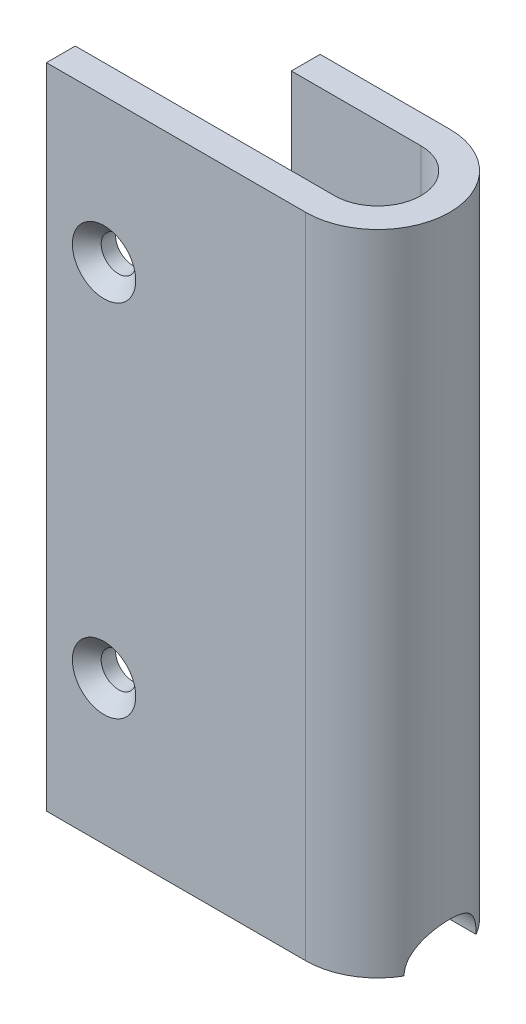
ISO-10303-21;
HEADER;
FILE_DESCRIPTION(('STEP AP214'),'2;1');
FILE_NAME('part.step','',(''),(''),'','','');
FILE_SCHEMA(('AUTOMOTIVE_DESIGN { 1 0 10303 214 1 1 1 1 }'));
ENDSEC;
DATA;
#1=APPLICATION_CONTEXT('core data for automotive mechanical design processes');
#2=APPLICATION_PROTOCOL_DEFINITION('international standard','automotive_design',2000,#1);
#3=PRODUCT_CONTEXT('',#1,'mechanical');
#4=PRODUCT('Part','Part','',(#3));
#5=PRODUCT_RELATED_PRODUCT_CATEGORY('part','',(#4));
#6=PRODUCT_DEFINITION_FORMATION('','',#4);
#7=PRODUCT_DEFINITION_CONTEXT('part definition',#1,'design');
#8=PRODUCT_DEFINITION('design','',#6,#7);
#9=PRODUCT_DEFINITION_SHAPE('','',#8);
#10=(LENGTH_UNIT() NAMED_UNIT(*) SI_UNIT(.MILLI.,.METRE.));
#11=(NAMED_UNIT(*) PLANE_ANGLE_UNIT() SI_UNIT($,.RADIAN.));
#12=(NAMED_UNIT(*) SI_UNIT($,.STERADIAN.) SOLID_ANGLE_UNIT());
#13=UNCERTAINTY_MEASURE_WITH_UNIT(LENGTH_MEASURE(1.E-05),#10,'distance_accuracy_value','');
#14=(GEOMETRIC_REPRESENTATION_CONTEXT(3) GLOBAL_UNCERTAINTY_ASSIGNED_CONTEXT((#13)) GLOBAL_UNIT_ASSIGNED_CONTEXT((#10,
#11,#12)) REPRESENTATION_CONTEXT('',''));
#15=CARTESIAN_POINT('',(0.,0.,0.));
#16=DIRECTION('',(0.,0.,1.));
#17=DIRECTION('',(1.,0.,0.));
#18=AXIS2_PLACEMENT_3D('',#15,#16,#17);
#19=CARTESIAN_POINT('',(0.,45.,0.));
#20=DIRECTION('',(0.,-1.,0.));
#21=DIRECTION('',(0.,0.,-1.));
#22=AXIS2_PLACEMENT_3D('',#19,#20,#21);
#23=CYLINDRICAL_SURFACE('',#22,5.);
#24=CARTESIAN_POINT('',(4.33012701892219,0.,-2.5));
#25=CARTESIAN_POINT('',(4.33010776213733,0.0654724350316677,-2.50001179836251));
#26=CARTESIAN_POINT('',(4.33161146224051,0.130934169776571,-2.49742842336447));
#27=CARTESIAN_POINT('',(4.33751978184666,0.261285899844576,-2.48716418163323));
#28=CARTESIAN_POINT('',(4.34192261900449,0.326176221640754,-2.47948644681233));
#29=CARTESIAN_POINT('',(4.35345141400719,0.454547532744297,-2.45918447990414));
#30=CARTESIAN_POINT('',(4.36056161975426,0.518034467963284,-2.44658885069503));
#31=CARTESIAN_POINT('',(4.37724282284499,0.643527614087744,-2.41661724515945));
#32=CARTESIAN_POINT('',(4.38681410283551,0.705533654022406,-2.3992407197456));
#33=CARTESIAN_POINT('',(4.41871214349951,0.888464031589053,-2.34029688750615));
#34=CARTESIAN_POINT('',(4.44426107983369,1.00668892728128,-2.29185258147667));
#35=CARTESIAN_POINT('',(4.50102114369154,1.23341693587535,-2.17826216975077));
#36=CARTESIAN_POINT('',(4.53224102252611,1.34190463038616,-2.11309018504652));
#37=CARTESIAN_POINT('',(4.59992530155802,1.55577114238783,-1.96165876169868));
#38=CARTESIAN_POINT('',(4.63660980230517,1.66016997889454,-1.87411057186877));
#39=CARTESIAN_POINT('',(4.70930785657946,1.85354271470454,-1.68311069098592));
#40=CARTESIAN_POINT('',(4.74532122571924,1.94251242917414,-1.57965469957761));
#41=CARTESIAN_POINT('',(4.81553674339751,2.10841707238449,-1.35122448738113));
#42=CARTESIAN_POINT('',(4.84945238909967,2.18413370998771,-1.22526897701463));
#43=CARTESIAN_POINT('',(4.90876871743035,2.31285185160815,-0.960393600863944));
#44=CARTESIAN_POINT('',(4.93417470668173,2.3658675177187,-0.821481883935598));
#45=CARTESIAN_POINT('',(4.9720113803684,2.44376131740857,-0.545113455243545));
#46=CARTESIAN_POINT('',(4.98523678997644,2.47037337425095,-0.408256720567087));
#47=CARTESIAN_POINT('',(5.00018956643823,2.50041524569561,-0.131428863746883));
#48=CARTESIAN_POINT('',(5.00192370311413,2.50385870956598,0.00854037595561001));
#49=CARTESIAN_POINT('',(4.99407451216908,2.48813324304431,0.274582525450838));
#50=CARTESIAN_POINT('',(4.98546223180199,2.47090463519448,0.40080541240597));
#51=CARTESIAN_POINT('',(4.95935579725978,2.41779719968455,0.648286752405086));
#52=CARTESIAN_POINT('',(4.94186114786187,2.38191733214957,0.769544928241872));
#53=CARTESIAN_POINT('',(4.89928974288563,2.29229393966775,1.00577259267237));
#54=CARTESIAN_POINT('',(4.87411141896958,2.23831009471259,1.12063184244932));
#55=CARTESIAN_POINT('',(4.81844159486509,2.11434242062065,1.3399404674424));
#56=CARTESIAN_POINT('',(4.78794811508603,2.04435262714526,1.44438594125974));
#57=CARTESIAN_POINT('',(4.72111214797706,1.8827673990732,1.65042713157186));
#58=CARTESIAN_POINT('',(4.68448924833205,1.78975568976913,1.75082198597595));
#59=CARTESIAN_POINT('',(4.61136315843599,1.58853854847496,1.9352501871044));
#60=CARTESIAN_POINT('',(4.5748601047173,1.48031958801658,2.01926880480682));
#61=CARTESIAN_POINT('',(4.503579139904,1.24330068232173,2.1738171411083));
#62=CARTESIAN_POINT('',(4.46906219482226,1.11362572851798,2.24313548885981));
#63=CARTESIAN_POINT('',(4.40934996096533,0.842442531530035,2.35836398289386));
#64=CARTESIAN_POINT('',(4.38413238163266,0.700963594907247,2.40433020546799));
#65=CARTESIAN_POINT('',(4.35412015572563,0.465222711798028,2.45809029210406));
#66=CARTESIAN_POINT('',(4.34521143406772,0.373217559621034,2.47373896858613));
#67=CARTESIAN_POINT('',(4.33317629399904,0.187508830095871,2.49472015739655));
#68=CARTESIAN_POINT('',(4.33006008341912,0.0938025477150808,2.50003445877024));
#69=CARTESIAN_POINT('',(4.33012701892219,0.,2.5));
#70=B_SPLINE_CURVE_WITH_KNOTS('',3,(#24,#25,#26,#27,#28,#29,#30,#31,#32,#33,#34,#35,#36,#37,#38,
#39,#40,#41,#42,#43,#44,#45,#46,#47,#48,#49,#50,#51,#52,#53,#54,#55,#56,#57,#58,#59,#60,#61,#62,
#63,#64,#65,#66,#67,#68,#69),.UNSPECIFIED.,.F.,.F.,(4,2,2,2,2,2,2,2,2,2,2,2,2,2,2,2,2,2,2,2,2,2,
4),(0.,0.196331555537111,0.392542521988314,0.587628912502733,0.782737718108245,1.17178476798555,
1.56143737011987,1.98295902719593,2.40459483519142,2.85470113901088,3.30452623161875,
3.72233927392692,4.13990614928148,4.52116163006039,4.90243836948527,5.28899106640394,
5.67568804085465,6.09890794628564,6.52250676283661,6.97328472614771,7.42297504209209,
7.703516039156,7.98455095154996),.UNSPECIFIED.);
#71=CARTESIAN_POINT('',(4.33012701892219,0.,-2.5));
#72=VERTEX_POINT('',#71);
#73=CARTESIAN_POINT('',(4.33012701892219,0.,2.5));
#74=VERTEX_POINT('',#73);
#75=EDGE_CURVE('E53',#72,#74,#70,.T.);
#76=ORIENTED_EDGE('',*,*,#75,.F.);
#77=CARTESIAN_POINT('',(0.,0.,0.));
#78=DIRECTION('',(0.,1.,0.));
#79=DIRECTION('',(0.,0.,1.));
#80=AXIS2_PLACEMENT_3D('',#77,#78,#79);
#81=CIRCLE('',#80,5.);
#82=CARTESIAN_POINT('',(0.,0.,-5.));
#83=VERTEX_POINT('',#82);
#84=EDGE_CURVE('E255',#72,#83,#81,.T.);
#85=ORIENTED_EDGE('',*,*,#84,.T.);
#86=DIRECTION('',(0.,-1.,0.));
#87=VECTOR('',#86,1.);
#88=CARTESIAN_POINT('',(0.,45.,-5.));
#89=LINE('',#88,#87);
#90=CARTESIAN_POINT('',(0.,45.,-5.));
#91=VERTEX_POINT('',#90);
#92=EDGE_CURVE('E183',#91,#83,#89,.T.);
#93=ORIENTED_EDGE('',*,*,#92,.F.);
#94=CARTESIAN_POINT('',(0.,45.,0.));
#95=DIRECTION('',(0.,1.,0.));
#96=DIRECTION('',(0.,0.,1.));
#97=AXIS2_PLACEMENT_3D('',#94,#95,#96);
#98=CIRCLE('',#97,5.);
#99=CARTESIAN_POINT('',(0.,45.,5.));
#100=VERTEX_POINT('',#99);
#101=EDGE_CURVE('E160',#100,#91,#98,.T.);
#102=ORIENTED_EDGE('',*,*,#101,.F.);
#103=DIRECTION('',(0.,-1.,0.));
#104=VECTOR('',#103,1.);
#105=CARTESIAN_POINT('',(0.,45.,5.));
#106=LINE('',#105,#104);
#107=CARTESIAN_POINT('',(0.,0.,5.));
#108=VERTEX_POINT('',#107);
#109=EDGE_CURVE('E161',#100,#108,#106,.T.);
#110=ORIENTED_EDGE('',*,*,#109,.T.);
#111=EDGE_CURVE('E257',#108,#74,#81,.T.);
#112=ORIENTED_EDGE('',*,*,#111,.T.);
#113=EDGE_LOOP('',(#76,#85,#93,#102,#110,#112));
#114=FACE_BOUND('',#113,.T.);
#115=ADVANCED_FACE('F37',(#114),#23,.T.);
#116=CARTESIAN_POINT('',(0.,45.,0.));
#117=DIRECTION('',(0.,-1.,0.));
#118=DIRECTION('',(0.,0.,-1.));
#119=AXIS2_PLACEMENT_3D('',#116,#117,#118);
#120=CYLINDRICAL_SURFACE('',#119,3.);
#121=CARTESIAN_POINT('',(1.6583123951777,0.,2.5));
#122=CARTESIAN_POINT('',(1.65828023930748,0.0446676190961317,2.50001053689097));
#123=CARTESIAN_POINT('',(1.6601162772629,0.0893146756582369,2.4988033626358));
#124=CARTESIAN_POINT('',(1.66727317263237,0.178118808575002,2.49403945424106));
#125=CARTESIAN_POINT('',(1.6725873117957,0.222276662985004,2.49048724961452));
#126=CARTESIAN_POINT('',(1.68634898291668,0.309186552805204,2.48118723003889));
#127=CARTESIAN_POINT('',(1.69474943169534,0.351949707497493,2.47547237004125));
#128=CARTESIAN_POINT('',(1.71430901873713,0.436516845554968,2.46196831278083));
#129=CARTESIAN_POINT('',(1.72546968412583,0.478320283905717,2.4541779670438));
#130=CARTESIAN_POINT('',(1.77222694334977,0.634726425048257,2.42094569151118));
#131=CARTESIAN_POINT('',(1.81578246635465,0.745590990119863,2.38888265367655));
#132=CARTESIAN_POINT('',(1.91309058631366,0.958667215286081,2.31170305357438));
#133=CARTESIAN_POINT('',(1.96692669689501,1.06079733200861,2.26647787223487));
#134=CARTESIAN_POINT('',(2.06333806009318,1.22908717969098,2.17845139252835));
#135=CARTESIAN_POINT('',(2.1048774408808,1.29734727342663,2.13847839662807));
#136=CARTESIAN_POINT('',(2.18877312173698,1.42945216003766,2.05253160808423));
#137=CARTESIAN_POINT('',(2.23112976012055,1.49329507193551,2.00655528279989));
#138=CARTESIAN_POINT('',(2.35737927069942,1.6779004660602,1.85992335660286));
#139=CARTESIAN_POINT('',(2.44073385868862,1.79220223726549,1.75032166679399));
#140=CARTESIAN_POINT('',(2.58107663651362,1.97858484857952,1.53332316028441));
#141=CARTESIAN_POINT('',(2.63991085386503,2.05448117836859,1.43037180448629));
#142=CARTESIAN_POINT('',(2.74774689794263,2.1913233385864,1.2102993528412));
#143=CARTESIAN_POINT('',(2.79676246687923,2.25229009148166,1.09319843428568));
#144=CARTESIAN_POINT('',(2.87372981565163,2.34711358323241,0.867928883305844));
#145=CARTESIAN_POINT('',(2.90385830152504,2.38383517864743,0.761717046456572));
#146=CARTESIAN_POINT('',(2.95260444248339,2.44298114981979,0.542830448073814));
#147=CARTESIAN_POINT('',(2.97122910862281,2.46541423403497,0.430159668824158));
#148=CARTESIAN_POINT('',(2.99549159829453,2.49460149180071,0.200906226670661));
#149=CARTESIAN_POINT('',(3.00107488681869,2.50128982658614,0.084309197767444));
#150=CARTESIAN_POINT('',(2.99858143920542,2.49829775944192,-0.148527340090261));
#151=CARTESIAN_POINT('',(2.99050499932993,2.48861771252143,-0.264766856743951));
#152=CARTESIAN_POINT('',(2.9624133944372,2.45478579221321,-0.485445759029536));
#153=CARTESIAN_POINT('',(2.94323604357122,2.4316490006219,-0.590153469719608));
#154=CARTESIAN_POINT('',(2.89501327215416,2.37305235039453,-0.793625750717645));
#155=CARTESIAN_POINT('',(2.86596638567854,2.33759066112049,-0.89238943559136));
#156=CARTESIAN_POINT('',(2.79690287446882,2.25240860554023,-1.09053416369654));
#157=CARTESIAN_POINT('',(2.7561602110168,2.20172771983301,-1.18924473934223));
#158=CARTESIAN_POINT('',(2.66744714285833,2.08960269254212,-1.37678007181262));
#159=CARTESIAN_POINT('',(2.61947031903861,2.02814898391746,-1.46559592577918));
#160=CARTESIAN_POINT('',(2.49448801107938,1.86454080960493,-1.67280362441447));
#161=CARTESIAN_POINT('',(2.41452810108691,1.75692904106795,-1.78517382835749));
#162=CARTESIAN_POINT('',(2.29203972156857,1.58276013263233,-1.93670155603641));
#163=CARTESIAN_POINT('',(2.25072647403066,1.52248619627438,-1.98442714978064));
#164=CARTESIAN_POINT('',(2.16828385513605,1.3977282287984,-2.07418686478912));
#165=CARTESIAN_POINT('',(2.12715442261522,1.33324573004269,-2.11622304065683));
#166=CARTESIAN_POINT('',(2.02736668216146,1.16889290959049,-2.2128219038431));
#167=CARTESIAN_POINT('',(1.96949413582952,1.06656162182181,-2.26406445132993));
#168=CARTESIAN_POINT('',(1.86215058777701,0.852162280933745,-2.35313154217165));
#169=CARTESIAN_POINT('',(1.81265778441366,0.740120677710054,-2.39099119237605));
#170=CARTESIAN_POINT('',(1.74312521040049,0.542368123492112,-2.44187928159533));
#171=CARTESIAN_POINT('',(1.71871174214238,0.459278569532435,-2.45896760338397));
#172=CARTESIAN_POINT('',(1.68136078058062,0.289382777852337,-2.48466533863309));
#173=CARTESIAN_POINT('',(1.66838023493806,0.202591784872539,-2.49330657445815));
#174=CARTESIAN_POINT('',(1.66098011654761,0.0960725270432394,-2.49822814088172));
#175=CARTESIAN_POINT('',(1.65998140373825,0.0768814878014884,-2.49889195042314));
#176=CARTESIAN_POINT('',(1.65864846758548,0.0384623376736757,-2.49977745262101));
#177=CARTESIAN_POINT('',(1.65831437598636,0.0192342201937559,-2.49999905762164));
#178=CARTESIAN_POINT('',(1.6583123951777,0.,-2.5));
#179=B_SPLINE_CURVE_WITH_KNOTS('',3,(#121,#122,#123,#124,#125,#126,#127,#128,#129,#130,#131,
#132,#133,#134,#135,#136,#137,#138,#139,#140,#141,#142,#143,#144,#145,#146,#147,#148,#149,#150,
#151,#152,#153,#154,#155,#156,#157,#158,#159,#160,#161,#162,#163,#164,#165,#166,#167,#168,#169,
#170,#171,#172,#173,#174,#175,#176,#177,#178),.UNSPECIFIED.,.F.,.F.,(4,2,2,2,2,2,2,2,2,2,2,2,2,
2,2,2,2,2,2,2,2,2,2,2,2,2,2,2,4),(0.,0.133915809511519,0.267573709534379,0.399271959248707,
0.531043236367043,0.898867426511492,1.26981755381918,1.53753000139772,1.80535575667043,
2.33924592067391,2.76010881123974,3.18037848070635,3.52797653415752,3.87536253284726,
4.22419861170399,4.57302712485182,4.89843954153486,5.22390031294722,5.57721326116426,
5.93084158108768,6.45264424433969,6.71427180911988,6.97580463953598,7.35949670871463,
7.74217465007992,8.00607441227289,8.26897611958204,8.32665105551861,8.38433742291031),.UNSPECIFIED.);
#180=CARTESIAN_POINT('',(1.6583123951777,0.,2.5));
#181=VERTEX_POINT('',#180);
#182=CARTESIAN_POINT('',(1.6583123951777,0.,-2.5));
#183=VERTEX_POINT('',#182);
#184=EDGE_CURVE('E126',#181,#183,#179,.T.);
#185=ORIENTED_EDGE('',*,*,#184,.F.);
#186=CARTESIAN_POINT('',(0.,0.,0.));
#187=DIRECTION('',(0.,-1.,0.));
#188=DIRECTION('',(0.,0.,1.));
#189=AXIS2_PLACEMENT_3D('',#186,#187,#188);
#190=CIRCLE('',#189,3.);
#191=CARTESIAN_POINT('',(0.,0.,3.));
#192=VERTEX_POINT('',#191);
#193=EDGE_CURVE('E138',#181,#192,#190,.T.);
#194=ORIENTED_EDGE('',*,*,#193,.T.);
#195=DIRECTION('',(0.,-1.,0.));
#196=VECTOR('',#195,1.);
#197=CARTESIAN_POINT('',(0.,45.,3.));
#198=LINE('',#197,#196);
#199=CARTESIAN_POINT('',(0.,45.,3.));
#200=VERTEX_POINT('',#199);
#201=EDGE_CURVE('E171',#200,#192,#198,.T.);
#202=ORIENTED_EDGE('',*,*,#201,.F.);
#203=CARTESIAN_POINT('',(0.,45.,0.));
#204=DIRECTION('',(0.,-1.,0.));
#205=DIRECTION('',(0.,0.,1.));
#206=AXIS2_PLACEMENT_3D('',#203,#204,#205);
#207=CIRCLE('',#206,3.);
#208=CARTESIAN_POINT('',(0.,45.,-3.));
#209=VERTEX_POINT('',#208);
#210=EDGE_CURVE('E277',#209,#200,#207,.T.);
#211=ORIENTED_EDGE('',*,*,#210,.F.);
#212=DIRECTION('',(0.,-1.,0.));
#213=VECTOR('',#212,1.);
#214=CARTESIAN_POINT('',(0.,45.,-3.));
#215=LINE('',#214,#213);
#216=CARTESIAN_POINT('',(0.,0.,-3.));
#217=VERTEX_POINT('',#216);
#218=EDGE_CURVE('E173',#209,#217,#215,.T.);
#219=ORIENTED_EDGE('',*,*,#218,.T.);
#220=EDGE_CURVE('E142',#217,#183,#190,.T.);
#221=ORIENTED_EDGE('',*,*,#220,.T.);
#222=EDGE_LOOP('',(#185,#194,#202,#211,#219,#221));
#223=FACE_BOUND('',#222,.T.);
#224=ADVANCED_FACE('F136',(#223),#120,.F.);
#225=CARTESIAN_POINT('',(0.,0.,0.));
#226=DIRECTION('',(0.,1.,0.));
#227=DIRECTION('',(0.,0.,1.));
#228=AXIS2_PLACEMENT_3D('',#225,#226,#227);
#229=PLANE('',#228);
#230=DIRECTION('',(-1.,0.,0.));
#231=VECTOR('',#230,1.);
#232=CARTESIAN_POINT('',(6.,0.,-2.5));
#233=LINE('',#232,#231);
#234=EDGE_CURVE('E11',#183,#72,#233,.F.);
#235=ORIENTED_EDGE('',*,*,#234,.F.);
#236=ORIENTED_EDGE('',*,*,#220,.F.);
#237=DIRECTION('',(1.,0.,0.));
#238=VECTOR('',#237,1.);
#239=CARTESIAN_POINT('',(0.,0.,-3.));
#240=LINE('',#239,#238);
#241=CARTESIAN_POINT('',(-9.,0.,-3.));
#242=VERTEX_POINT('',#241);
#243=EDGE_CURVE('E149',#242,#217,#240,.T.);
#244=ORIENTED_EDGE('',*,*,#243,.F.);
#245=DIRECTION('',(0.,0.,1.));
#246=VECTOR('',#245,1.);
#247=CARTESIAN_POINT('',(-9.,0.,-5.));
#248=LINE('',#247,#246);
#249=CARTESIAN_POINT('',(-9.,0.,-5.));
#250=VERTEX_POINT('',#249);
#251=EDGE_CURVE('E151',#250,#242,#248,.T.);
#252=ORIENTED_EDGE('',*,*,#251,.F.);
#253=DIRECTION('',(-1.,0.,0.));
#254=VECTOR('',#253,1.);
#255=CARTESIAN_POINT('',(0.,0.,-5.));
#256=LINE('',#255,#254);
#257=EDGE_CURVE('E261',#83,#250,#256,.T.);
#258=ORIENTED_EDGE('',*,*,#257,.F.);
#259=ORIENTED_EDGE('',*,*,#84,.F.);
#260=EDGE_LOOP('',(#235,#236,#244,#252,#258,#259));
#261=FACE_BOUND('',#260,.T.);
#262=ADVANCED_FACE('F228',(#261),#229,.F.);
#263=DIRECTION('',(-1.,0.,0.));
#264=VECTOR('',#263,1.);
#265=CARTESIAN_POINT('',(6.,0.,2.5));
#266=LINE('',#265,#264);
#267=EDGE_CURVE('E46',#74,#181,#266,.T.);
#268=ORIENTED_EDGE('',*,*,#267,.F.);
#269=ORIENTED_EDGE('',*,*,#111,.F.);
#270=DIRECTION('',(1.,0.,0.));
#271=VECTOR('',#270,1.);
#272=CARTESIAN_POINT('',(0.,0.,5.));
#273=LINE('',#272,#271);
#274=CARTESIAN_POINT('',(-18.,0.,5.));
#275=VERTEX_POINT('',#274);
#276=EDGE_CURVE('E158',#275,#108,#273,.T.);
#277=ORIENTED_EDGE('',*,*,#276,.F.);
#278=DIRECTION('',(0.,0.,1.));
#279=VECTOR('',#278,1.);
#280=CARTESIAN_POINT('',(-18.,0.,3.));
#281=LINE('',#280,#279);
#282=CARTESIAN_POINT('',(-18.,0.,3.));
#283=VERTEX_POINT('',#282);
#284=EDGE_CURVE('E156',#283,#275,#281,.T.);
#285=ORIENTED_EDGE('',*,*,#284,.F.);
#286=DIRECTION('',(-1.,0.,0.));
#287=VECTOR('',#286,1.);
#288=CARTESIAN_POINT('',(0.,0.,3.));
#289=LINE('',#288,#287);
#290=EDGE_CURVE('E148',#192,#283,#289,.T.);
#291=ORIENTED_EDGE('',*,*,#290,.F.);
#292=ORIENTED_EDGE('',*,*,#193,.F.);
#293=EDGE_LOOP('',(#268,#269,#277,#285,#291,#292));
#294=FACE_BOUND('',#293,.T.);
#295=ADVANCED_FACE('F146',(#294),#229,.F.);
#296=CARTESIAN_POINT('',(-9.,45.,-5.));
#297=DIRECTION('',(1.,0.,0.));
#298=DIRECTION('',(0.,0.,-1.));
#299=AXIS2_PLACEMENT_3D('',#296,#297,#298);
#300=PLANE('',#299);
#301=DIRECTION('',(0.,-1.,0.));
#302=VECTOR('',#301,1.);
#303=CARTESIAN_POINT('',(-9.,45.,-3.));
#304=LINE('',#303,#302);
#305=CARTESIAN_POINT('',(-9.,16.5,-3.));
#306=VERTEX_POINT('',#305);
#307=EDGE_CURVE('E175',#306,#242,#304,.T.);
#308=ORIENTED_EDGE('',*,*,#307,.F.);
#309=DIRECTION('',(0.,0.,-1.));
#310=VECTOR('',#309,1.);
#311=CARTESIAN_POINT('',(-9.,16.5,0.));
#312=LINE('',#311,#310);
#313=CARTESIAN_POINT('',(-9.,16.5,-5.));
#314=VERTEX_POINT('',#313);
#315=EDGE_CURVE('E61',#306,#314,#312,.T.);
#316=ORIENTED_EDGE('',*,*,#315,.T.);
#317=DIRECTION('',(0.,-1.,0.));
#318=VECTOR('',#317,1.);
#319=CARTESIAN_POINT('',(-9.,45.,-5.));
#320=LINE('',#319,#318);
#321=EDGE_CURVE('E179',#314,#250,#320,.T.);
#322=ORIENTED_EDGE('',*,*,#321,.T.);
#323=ORIENTED_EDGE('',*,*,#251,.T.);
#324=EDGE_LOOP('',(#308,#316,#322,#323));
#325=FACE_BOUND('',#324,.T.);
#326=ADVANCED_FACE('F272',(#325),#300,.F.);
#327=CARTESIAN_POINT('',(0.,45.,-5.));
#328=DIRECTION('',(0.,0.,1.));
#329=DIRECTION('',(1.,0.,0.));
#330=AXIS2_PLACEMENT_3D('',#327,#328,#329);
#331=PLANE('',#330);
#332=ORIENTED_EDGE('',*,*,#321,.F.);
#333=CARTESIAN_POINT('',(-9.,17.5,-5.));
#334=DIRECTION('',(0.,0.,-1.));
#335=DIRECTION('',(-1.,0.,0.));
#336=AXIS2_PLACEMENT_3D('',#333,#334,#335);
#337=CIRCLE('',#336,1.);
#338=CARTESIAN_POINT('',(-9.,18.5,-5.));
#339=VERTEX_POINT('',#338);
#340=EDGE_CURVE('E258',#339,#314,#337,.T.);
#341=ORIENTED_EDGE('',*,*,#340,.F.);
#342=CARTESIAN_POINT('',(-9.,45.,-5.));
#343=VERTEX_POINT('',#342);
#344=EDGE_CURVE('E180',#343,#339,#320,.T.);
#345=ORIENTED_EDGE('',*,*,#344,.F.);
#346=DIRECTION('',(-1.,0.,0.));
#347=VECTOR('',#346,1.);
#348=CARTESIAN_POINT('',(0.,45.,-5.));
#349=LINE('',#348,#347);
#350=EDGE_CURVE('E295',#91,#343,#349,.T.);
#351=ORIENTED_EDGE('',*,*,#350,.F.);
#352=ORIENTED_EDGE('',*,*,#92,.T.);
#353=ORIENTED_EDGE('',*,*,#257,.T.);
#354=EDGE_LOOP('',(#332,#341,#345,#351,#352,#353));
#355=FACE_BOUND('',#354,.T.);
#356=ADVANCED_FACE('F306',(#355),#331,.F.);
#357=ORIENTED_EDGE('',*,*,#344,.T.);
#358=DIRECTION('',(0.,0.,-1.));
#359=VECTOR('',#358,1.);
#360=CARTESIAN_POINT('',(-9.,18.5,0.));
#361=LINE('',#360,#359);
#362=CARTESIAN_POINT('',(-9.,18.5,-3.));
#363=VERTEX_POINT('',#362);
#364=EDGE_CURVE('E263',#339,#363,#361,.F.);
#365=ORIENTED_EDGE('',*,*,#364,.T.);
#366=CARTESIAN_POINT('',(-9.,45.,-3.));
#367=VERTEX_POINT('',#366);
#368=EDGE_CURVE('E176',#367,#363,#304,.T.);
#369=ORIENTED_EDGE('',*,*,#368,.F.);
#370=DIRECTION('',(0.,0.,1.));
#371=VECTOR('',#370,1.);
#372=CARTESIAN_POINT('',(-9.,45.,-5.));
#373=LINE('',#372,#371);
#374=EDGE_CURVE('E284',#343,#367,#373,.T.);
#375=ORIENTED_EDGE('',*,*,#374,.F.);
#376=EDGE_LOOP('',(#357,#365,#369,#375));
#377=FACE_BOUND('',#376,.T.);
#378=ADVANCED_FACE('F245',(#377),#300,.F.);
#379=CARTESIAN_POINT('',(0.,45.,-3.));
#380=DIRECTION('',(0.,0.,-1.));
#381=DIRECTION('',(-1.,0.,0.));
#382=AXIS2_PLACEMENT_3D('',#379,#380,#381);
#383=PLANE('',#382);
#384=ORIENTED_EDGE('',*,*,#368,.T.);
#385=CARTESIAN_POINT('',(-9.,17.5,-3.));
#386=DIRECTION('',(0.,0.,-1.));
#387=DIRECTION('',(-1.,0.,0.));
#388=AXIS2_PLACEMENT_3D('',#385,#386,#387);
#389=CIRCLE('',#388,1.);
#390=EDGE_CURVE('E132',#363,#306,#389,.T.);
#391=ORIENTED_EDGE('',*,*,#390,.T.);
#392=ORIENTED_EDGE('',*,*,#307,.T.);
#393=ORIENTED_EDGE('',*,*,#243,.T.);
#394=ORIENTED_EDGE('',*,*,#218,.F.);
#395=DIRECTION('',(1.,0.,0.));
#396=VECTOR('',#395,1.);
#397=CARTESIAN_POINT('',(0.,45.,-3.));
#398=LINE('',#397,#396);
#399=EDGE_CURVE('E280',#367,#209,#398,.T.);
#400=ORIENTED_EDGE('',*,*,#399,.F.);
#401=EDGE_LOOP('',(#384,#391,#392,#393,#394,#400));
#402=FACE_BOUND('',#401,.T.);
#403=ADVANCED_FACE('F240',(#402),#383,.F.);
#404=CARTESIAN_POINT('',(0.,45.,3.));
#405=DIRECTION('',(0.,0.,1.));
#406=DIRECTION('',(1.,0.,0.));
#407=AXIS2_PLACEMENT_3D('',#404,#405,#406);
#408=PLANE('',#407);
#409=CARTESIAN_POINT('',(-14.,35.,3.));
#410=DIRECTION('',(0.,0.,1.));
#411=DIRECTION('',(1.,0.,0.));
#412=AXIS2_PLACEMENT_3D('',#409,#410,#411);
#413=CIRCLE('',#412,1.2);
#414=CARTESIAN_POINT('',(-12.8,35.,3.));
#415=VERTEX_POINT('',#414);
#416=EDGE_CURVE('E41',#415,#415,#413,.T.);
#417=ORIENTED_EDGE('',*,*,#416,.T.);
#418=EDGE_LOOP('',(#417));
#419=FACE_BOUND('',#418,.T.);
#420=CARTESIAN_POINT('',(-14.,9.99999999999999,3.));
#421=DIRECTION('',(0.,0.,1.));
#422=DIRECTION('',(1.,0.,0.));
#423=AXIS2_PLACEMENT_3D('',#420,#421,#422);
#424=CIRCLE('',#423,1.2);
#425=CARTESIAN_POINT('',(-12.8,9.99999999999999,3.));
#426=VERTEX_POINT('',#425);
#427=EDGE_CURVE('E143',#426,#426,#424,.T.);
#428=ORIENTED_EDGE('',*,*,#427,.T.);
#429=EDGE_LOOP('',(#428));
#430=FACE_BOUND('',#429,.T.);
#431=ORIENTED_EDGE('',*,*,#290,.T.);
#432=DIRECTION('',(0.,-1.,0.));
#433=VECTOR('',#432,1.);
#434=CARTESIAN_POINT('',(-18.,45.,3.));
#435=LINE('',#434,#433);
#436=CARTESIAN_POINT('',(-18.,45.,3.));
#437=VERTEX_POINT('',#436);
#438=EDGE_CURVE('E168',#437,#283,#435,.T.);
#439=ORIENTED_EDGE('',*,*,#438,.F.);
#440=DIRECTION('',(-1.,0.,0.));
#441=VECTOR('',#440,1.);
#442=CARTESIAN_POINT('',(0.,45.,3.));
#443=LINE('',#442,#441);
#444=EDGE_CURVE('E279',#200,#437,#443,.T.);
#445=ORIENTED_EDGE('',*,*,#444,.F.);
#446=ORIENTED_EDGE('',*,*,#201,.T.);
#447=EDGE_LOOP('',(#431,#439,#445,#446));
#448=FACE_BOUND('',#447,.T.);
#449=ADVANCED_FACE('F237',(#419,#430,#448),#408,.F.);
#450=CARTESIAN_POINT('',(-18.,45.,3.));
#451=DIRECTION('',(1.,0.,0.));
#452=DIRECTION('',(0.,0.,-1.));
#453=AXIS2_PLACEMENT_3D('',#450,#451,#452);
#454=PLANE('',#453);
#455=ORIENTED_EDGE('',*,*,#284,.T.);
#456=DIRECTION('',(0.,-1.,0.));
#457=VECTOR('',#456,1.);
#458=CARTESIAN_POINT('',(-18.,45.,5.));
#459=LINE('',#458,#457);
#460=CARTESIAN_POINT('',(-18.,45.,5.));
#461=VERTEX_POINT('',#460);
#462=EDGE_CURVE('E164',#461,#275,#459,.T.);
#463=ORIENTED_EDGE('',*,*,#462,.F.);
#464=DIRECTION('',(0.,0.,1.));
#465=VECTOR('',#464,1.);
#466=CARTESIAN_POINT('',(-18.,45.,3.));
#467=LINE('',#466,#465);
#468=EDGE_CURVE('E282',#437,#461,#467,.T.);
#469=ORIENTED_EDGE('',*,*,#468,.F.);
#470=ORIENTED_EDGE('',*,*,#438,.T.);
#471=EDGE_LOOP('',(#455,#463,#469,#470));
#472=FACE_BOUND('',#471,.T.);
#473=ADVANCED_FACE('F234',(#472),#454,.F.);
#474=CARTESIAN_POINT('',(0.,45.,5.));
#475=DIRECTION('',(0.,0.,-1.));
#476=DIRECTION('',(-1.,0.,0.));
#477=AXIS2_PLACEMENT_3D('',#474,#475,#476);
#478=PLANE('',#477);
#479=CARTESIAN_POINT('',(-14.,35.,5.));
#480=DIRECTION('',(0.,0.,1.));
#481=DIRECTION('',(1.,0.,0.));
#482=AXIS2_PLACEMENT_3D('',#479,#480,#481);
#483=CIRCLE('',#482,2.2);
#484=CARTESIAN_POINT('',(-11.8,35.,5.));
#485=VERTEX_POINT('',#484);
#486=EDGE_CURVE('E424',#485,#485,#483,.T.);
#487=ORIENTED_EDGE('',*,*,#486,.F.);
#488=EDGE_LOOP('',(#487));
#489=FACE_BOUND('',#488,.T.);
#490=CARTESIAN_POINT('',(-14.,9.99999999999999,5.));
#491=DIRECTION('',(0.,0.,1.));
#492=DIRECTION('',(1.,0.,0.));
#493=AXIS2_PLACEMENT_3D('',#490,#491,#492);
#494=CIRCLE('',#493,2.2);
#495=CARTESIAN_POINT('',(-11.8,9.99999999999999,5.));
#496=VERTEX_POINT('',#495);
#497=EDGE_CURVE('E191',#496,#496,#494,.T.);
#498=ORIENTED_EDGE('',*,*,#497,.F.);
#499=EDGE_LOOP('',(#498));
#500=FACE_BOUND('',#499,.T.);
#501=ORIENTED_EDGE('',*,*,#276,.T.);
#502=ORIENTED_EDGE('',*,*,#109,.F.);
#503=DIRECTION('',(1.,0.,0.));
#504=VECTOR('',#503,1.);
#505=CARTESIAN_POINT('',(0.,45.,5.));
#506=LINE('',#505,#504);
#507=EDGE_CURVE('E165',#461,#100,#506,.T.);
#508=ORIENTED_EDGE('',*,*,#507,.F.);
#509=ORIENTED_EDGE('',*,*,#462,.T.);
#510=EDGE_LOOP('',(#501,#502,#508,#509));
#511=FACE_BOUND('',#510,.T.);
#512=ADVANCED_FACE('F226',(#489,#500,#511),#478,.F.);
#513=CARTESIAN_POINT('',(0.,45.,0.));
#514=DIRECTION('',(0.,1.,0.));
#515=DIRECTION('',(0.,0.,1.));
#516=AXIS2_PLACEMENT_3D('',#513,#514,#515);
#517=PLANE('',#516);
#518=ORIENTED_EDGE('',*,*,#101,.T.);
#519=ORIENTED_EDGE('',*,*,#350,.T.);
#520=ORIENTED_EDGE('',*,*,#374,.T.);
#521=ORIENTED_EDGE('',*,*,#399,.T.);
#522=ORIENTED_EDGE('',*,*,#210,.T.);
#523=ORIENTED_EDGE('',*,*,#444,.T.);
#524=ORIENTED_EDGE('',*,*,#468,.T.);
#525=ORIENTED_EDGE('',*,*,#507,.T.);
#526=EDGE_LOOP('',(#518,#519,#520,#521,#522,#523,#524,#525));
#527=FACE_BOUND('',#526,.T.);
#528=ADVANCED_FACE('F223',(#527),#517,.T.);
#529=CARTESIAN_POINT('',(-9.,17.5,0.));
#530=DIRECTION('',(0.,0.,-1.));
#531=DIRECTION('',(-1.,0.,0.));
#532=AXIS2_PLACEMENT_3D('',#529,#530,#531);
#533=CYLINDRICAL_SURFACE('',#532,1.);
#534=ORIENTED_EDGE('',*,*,#390,.F.);
#535=ORIENTED_EDGE('',*,*,#364,.F.);
#536=ORIENTED_EDGE('',*,*,#340,.T.);
#537=ORIENTED_EDGE('',*,*,#315,.F.);
#538=EDGE_LOOP('',(#534,#535,#536,#537));
#539=FACE_BOUND('',#538,.T.);
#540=ADVANCED_FACE('F218',(#539),#533,.F.);
#541=CARTESIAN_POINT('',(6.,0.,0.));
#542=DIRECTION('',(-1.,0.,0.));
#543=DIRECTION('',(0.,0.,1.));
#544=AXIS2_PLACEMENT_3D('',#541,#542,#543);
#545=CYLINDRICAL_SURFACE('',#544,2.5);
#546=ORIENTED_EDGE('',*,*,#234,.T.);
#547=ORIENTED_EDGE('',*,*,#75,.T.);
#548=ORIENTED_EDGE('',*,*,#267,.T.);
#549=ORIENTED_EDGE('',*,*,#184,.T.);
#550=EDGE_LOOP('',(#546,#547,#548,#549));
#551=FACE_BOUND('',#550,.T.);
#552=ADVANCED_FACE('F125',(#551),#545,.F.);
#553=CARTESIAN_POINT('',(-14.,9.99999999999999,5.));
#554=DIRECTION('',(0.,0.,1.));
#555=DIRECTION('',(1.,0.,0.));
#556=AXIS2_PLACEMENT_3D('',#553,#554,#555);
#557=CYLINDRICAL_SURFACE('',#556,1.2);
#558=CARTESIAN_POINT('',(-14.,9.99999999999999,4.));
#559=DIRECTION('',(0.,0.,1.));
#560=DIRECTION('',(1.,0.,0.));
#561=AXIS2_PLACEMENT_3D('',#558,#559,#560);
#562=CIRCLE('',#561,1.2);
#563=CARTESIAN_POINT('',(-12.8,9.99999999999999,4.));
#564=VERTEX_POINT('',#563);
#565=EDGE_CURVE('E187',#564,#564,#562,.T.);
#566=ORIENTED_EDGE('',*,*,#565,.T.);
#567=EDGE_LOOP('',(#566));
#568=FACE_BOUND('',#567,.T.);
#569=ORIENTED_EDGE('',*,*,#427,.F.);
#570=EDGE_LOOP('',(#569));
#571=FACE_BOUND('',#570,.T.);
#572=ADVANCED_FACE('F217',(#568,#571),#557,.F.);
#573=CARTESIAN_POINT('',(-14.,9.99999999999999,5.));
#574=DIRECTION('',(0.,0.,1.));
#575=DIRECTION('',(1.,0.,0.));
#576=AXIS2_PLACEMENT_3D('',#573,#574,#575);
#577=CONICAL_SURFACE('',#576,2.2,0.785398163397448);
#578=ORIENTED_EDGE('',*,*,#565,.F.);
#579=EDGE_LOOP('',(#578));
#580=FACE_BOUND('',#579,.T.);
#581=ORIENTED_EDGE('',*,*,#497,.T.);
#582=EDGE_LOOP('',(#581));
#583=FACE_BOUND('',#582,.T.);
#584=ADVANCED_FACE('F387',(#580,#583),#577,.F.);
#585=CARTESIAN_POINT('',(-14.,35.,5.));
#586=DIRECTION('',(0.,0.,1.));
#587=DIRECTION('',(1.,0.,0.));
#588=AXIS2_PLACEMENT_3D('',#585,#586,#587);
#589=CYLINDRICAL_SURFACE('',#588,1.2);
#590=CARTESIAN_POINT('',(-14.,35.,4.));
#591=DIRECTION('',(0.,0.,1.));
#592=DIRECTION('',(1.,0.,0.));
#593=AXIS2_PLACEMENT_3D('',#590,#591,#592);
#594=CIRCLE('',#593,1.2);
#595=CARTESIAN_POINT('',(-12.8,35.,4.));
#596=VERTEX_POINT('',#595);
#597=EDGE_CURVE('E421',#596,#596,#594,.T.);
#598=ORIENTED_EDGE('',*,*,#597,.T.);
#599=EDGE_LOOP('',(#598));
#600=FACE_BOUND('',#599,.T.);
#601=ORIENTED_EDGE('',*,*,#416,.F.);
#602=EDGE_LOOP('',(#601));
#603=FACE_BOUND('',#602,.T.);
#604=ADVANCED_FACE('F395',(#600,#603),#589,.F.);
#605=CARTESIAN_POINT('',(-14.,35.,5.));
#606=DIRECTION('',(0.,0.,1.));
#607=DIRECTION('',(1.,0.,0.));
#608=AXIS2_PLACEMENT_3D('',#605,#606,#607);
#609=CONICAL_SURFACE('',#608,2.2,0.785398163397448);
#610=ORIENTED_EDGE('',*,*,#597,.F.);
#611=EDGE_LOOP('',(#610));
#612=FACE_BOUND('',#611,.T.);
#613=ORIENTED_EDGE('',*,*,#486,.T.);
#614=EDGE_LOOP('',(#613));
#615=FACE_BOUND('',#614,.T.);
#616=ADVANCED_FACE('F404',(#612,#615),#609,.F.);
#617=CLOSED_SHELL('',(#115,#224,#262,#295,#326,#356,#378,#403,#449,#473,#512,#528,#540,#552,
#572,#584,#604,#616));
#618=MANIFOLD_SOLID_BREP('B2',#617);
#619=ADVANCED_BREP_SHAPE_REPRESENTATION('',(#18,#618),#14);
#620=SHAPE_DEFINITION_REPRESENTATION(#9,#619);
ENDSEC;
END-ISO-10303-21;
